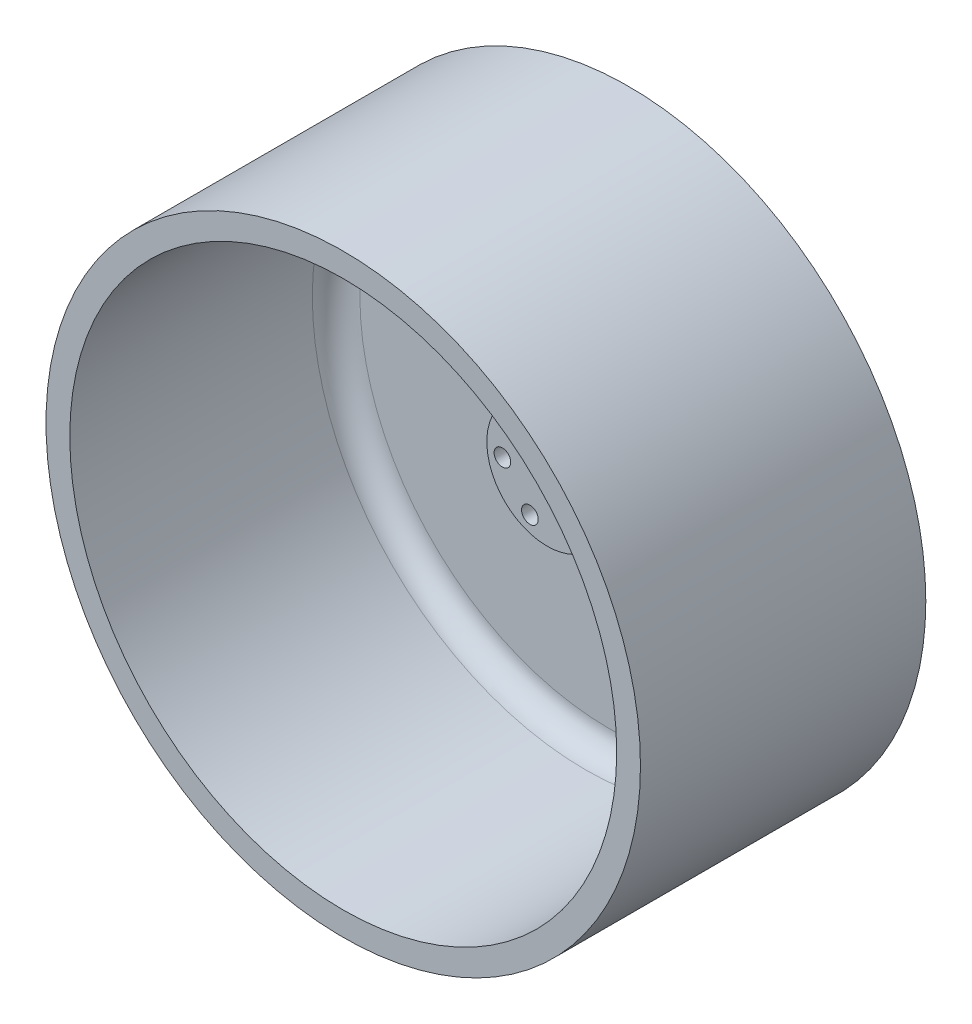
ISO-10303-21;
HEADER;
FILE_DESCRIPTION(('STEP AP214'),'2;1');
FILE_NAME('part.step','',(''),(''),'','','');
FILE_SCHEMA(('AUTOMOTIVE_DESIGN { 1 0 10303 214 1 1 1 1 }'));
ENDSEC;
DATA;
#1=APPLICATION_CONTEXT('core data for automotive mechanical design processes');
#2=APPLICATION_PROTOCOL_DEFINITION('international standard','automotive_design',2000,#1);
#3=PRODUCT_CONTEXT('',#1,'mechanical');
#4=PRODUCT('Part','Part','',(#3));
#5=PRODUCT_RELATED_PRODUCT_CATEGORY('part','',(#4));
#6=PRODUCT_DEFINITION_FORMATION('','',#4);
#7=PRODUCT_DEFINITION_CONTEXT('part definition',#1,'design');
#8=PRODUCT_DEFINITION('design','',#6,#7);
#9=PRODUCT_DEFINITION_SHAPE('','',#8);
#10=(LENGTH_UNIT() NAMED_UNIT(*) SI_UNIT(.MILLI.,.METRE.));
#11=(NAMED_UNIT(*) PLANE_ANGLE_UNIT() SI_UNIT($,.RADIAN.));
#12=(NAMED_UNIT(*) SI_UNIT($,.STERADIAN.) SOLID_ANGLE_UNIT());
#13=UNCERTAINTY_MEASURE_WITH_UNIT(LENGTH_MEASURE(1.E-05),#10,'distance_accuracy_value','');
#14=(GEOMETRIC_REPRESENTATION_CONTEXT(3) GLOBAL_UNCERTAINTY_ASSIGNED_CONTEXT((#13)) GLOBAL_UNIT_ASSIGNED_CONTEXT((#10,
#11,#12)) REPRESENTATION_CONTEXT('',''));
#15=CARTESIAN_POINT('',(0.,0.,0.));
#16=DIRECTION('',(0.,0.,1.));
#17=DIRECTION('',(1.,0.,0.));
#18=AXIS2_PLACEMENT_3D('',#15,#16,#17);
#19=CARTESIAN_POINT('',(-5.78430112425201,7.53603745372705,0.));
#20=DIRECTION('',(0.,0.,1.));
#21=DIRECTION('',(1.,0.,0.));
#22=AXIS2_PLACEMENT_3D('',#19,#20,#21);
#23=CYLINDRICAL_SURFACE('',#22,1.75);
#24=CARTESIAN_POINT('',(-5.78430112425201,7.53603745372705,17.11));
#25=DIRECTION('',(0.,0.,1.));
#26=DIRECTION('',(1.,0.,0.));
#27=AXIS2_PLACEMENT_3D('',#24,#25,#26);
#28=CIRCLE('',#27,1.75);
#29=CARTESIAN_POINT('',(-4.03430112425201,7.53603745372705,17.11));
#30=VERTEX_POINT('',#29);
#31=EDGE_CURVE('E88',#30,#30,#28,.T.);
#32=ORIENTED_EDGE('',*,*,#31,.T.);
#33=EDGE_LOOP('',(#32));
#34=FACE_BOUND('',#33,.T.);
#35=CARTESIAN_POINT('',(-5.78430112425201,7.53603745372705,3.));
#36=DIRECTION('',(0.,0.,-1.));
#37=DIRECTION('',(-1.,0.,0.));
#38=AXIS2_PLACEMENT_3D('',#35,#36,#37);
#39=CIRCLE('',#38,1.75);
#40=CARTESIAN_POINT('',(-7.53430112425201,7.53603745372705,3.));
#41=VERTEX_POINT('',#40);
#42=EDGE_CURVE('E57',#41,#41,#39,.F.);
#43=ORIENTED_EDGE('',*,*,#42,.F.);
#44=EDGE_LOOP('',(#43));
#45=FACE_BOUND('',#44,.T.);
#46=ADVANCED_FACE('F36',(#34,#45),#23,.F.);
#47=CARTESIAN_POINT('',(3.63424931667262,8.77737044360466,0.));
#48=DIRECTION('',(0.,0.,1.));
#49=DIRECTION('',(1.,0.,0.));
#50=AXIS2_PLACEMENT_3D('',#47,#48,#49);
#51=CYLINDRICAL_SURFACE('',#50,1.75);
#52=CARTESIAN_POINT('',(3.63424931667262,8.77737044360466,17.11));
#53=DIRECTION('',(0.,0.,1.));
#54=DIRECTION('',(1.,0.,0.));
#55=AXIS2_PLACEMENT_3D('',#52,#53,#54);
#56=CIRCLE('',#55,1.75);
#57=CARTESIAN_POINT('',(5.38424931667262,8.77737044360466,17.11));
#58=VERTEX_POINT('',#57);
#59=EDGE_CURVE('E96',#58,#58,#56,.T.);
#60=ORIENTED_EDGE('',*,*,#59,.T.);
#61=EDGE_LOOP('',(#60));
#62=FACE_BOUND('',#61,.T.);
#63=CARTESIAN_POINT('',(3.63424931667262,8.77737044360466,3.));
#64=DIRECTION('',(0.,0.,-1.));
#65=DIRECTION('',(-1.,0.,0.));
#66=AXIS2_PLACEMENT_3D('',#63,#64,#65);
#67=CIRCLE('',#66,1.75);
#68=CARTESIAN_POINT('',(1.88424931667262,8.77737044360466,3.));
#69=VERTEX_POINT('',#68);
#70=EDGE_CURVE('E61',#69,#69,#67,.F.);
#71=ORIENTED_EDGE('',*,*,#70,.F.);
#72=EDGE_LOOP('',(#71));
#73=FACE_BOUND('',#72,.T.);
#74=ADVANCED_FACE('F186',(#62,#73),#51,.F.);
#75=CARTESIAN_POINT('',(9.41855044092462,1.2413329898776,0.));
#76=DIRECTION('',(0.,0.,1.));
#77=DIRECTION('',(1.,0.,0.));
#78=AXIS2_PLACEMENT_3D('',#75,#76,#77);
#79=CYLINDRICAL_SURFACE('',#78,1.75);
#80=CARTESIAN_POINT('',(9.41855044092462,1.2413329898776,17.11));
#81=DIRECTION('',(0.,0.,1.));
#82=DIRECTION('',(1.,0.,0.));
#83=AXIS2_PLACEMENT_3D('',#80,#81,#82);
#84=CIRCLE('',#83,1.75);
#85=CARTESIAN_POINT('',(11.1685504409246,1.2413329898776,17.11));
#86=VERTEX_POINT('',#85);
#87=EDGE_CURVE('E92',#86,#86,#84,.T.);
#88=ORIENTED_EDGE('',*,*,#87,.T.);
#89=EDGE_LOOP('',(#88));
#90=FACE_BOUND('',#89,.T.);
#91=CARTESIAN_POINT('',(9.41855044092462,1.2413329898776,3.));
#92=DIRECTION('',(0.,0.,-1.));
#93=DIRECTION('',(-1.,0.,0.));
#94=AXIS2_PLACEMENT_3D('',#91,#92,#93);
#95=CIRCLE('',#94,1.75);
#96=CARTESIAN_POINT('',(7.66855044092462,1.2413329898776,3.));
#97=VERTEX_POINT('',#96);
#98=EDGE_CURVE('E64',#97,#97,#95,.F.);
#99=ORIENTED_EDGE('',*,*,#98,.F.);
#100=EDGE_LOOP('',(#99));
#101=FACE_BOUND('',#100,.T.);
#102=ADVANCED_FACE('F192',(#90,#101),#79,.F.);
#103=CARTESIAN_POINT('',(5.784301124252,-7.53603745372706,0.));
#104=DIRECTION('',(0.,0.,1.));
#105=DIRECTION('',(1.,0.,0.));
#106=AXIS2_PLACEMENT_3D('',#103,#104,#105);
#107=CYLINDRICAL_SURFACE('',#106,1.75);
#108=CARTESIAN_POINT('',(5.784301124252,-7.53603745372706,17.11));
#109=DIRECTION('',(0.,0.,1.));
#110=DIRECTION('',(1.,0.,0.));
#111=AXIS2_PLACEMENT_3D('',#108,#109,#110);
#112=CIRCLE('',#111,1.75);
#113=CARTESIAN_POINT('',(7.534301124252,-7.53603745372706,17.11));
#114=VERTEX_POINT('',#113);
#115=EDGE_CURVE('E95',#114,#114,#112,.T.);
#116=ORIENTED_EDGE('',*,*,#115,.T.);
#117=EDGE_LOOP('',(#116));
#118=FACE_BOUND('',#117,.T.);
#119=CARTESIAN_POINT('',(5.784301124252,-7.53603745372706,3.));
#120=DIRECTION('',(0.,0.,-1.));
#121=DIRECTION('',(-1.,0.,0.));
#122=AXIS2_PLACEMENT_3D('',#119,#120,#121);
#123=CIRCLE('',#122,1.75);
#124=CARTESIAN_POINT('',(4.034301124252,-7.53603745372706,3.));
#125=VERTEX_POINT('',#124);
#126=EDGE_CURVE('E67',#125,#125,#123,.F.);
#127=ORIENTED_EDGE('',*,*,#126,.F.);
#128=EDGE_LOOP('',(#127));
#129=FACE_BOUND('',#128,.T.);
#130=ADVANCED_FACE('F271',(#118,#129),#107,.F.);
#131=CARTESIAN_POINT('',(-3.63424931667262,-8.77737044360466,0.));
#132=DIRECTION('',(0.,0.,1.));
#133=DIRECTION('',(1.,0.,0.));
#134=AXIS2_PLACEMENT_3D('',#131,#132,#133);
#135=CYLINDRICAL_SURFACE('',#134,1.75);
#136=CARTESIAN_POINT('',(-3.63424931667262,-8.77737044360466,17.11));
#137=DIRECTION('',(0.,0.,1.));
#138=DIRECTION('',(1.,0.,0.));
#139=AXIS2_PLACEMENT_3D('',#136,#137,#138);
#140=CIRCLE('',#139,1.75);
#141=CARTESIAN_POINT('',(-1.88424931667262,-8.77737044360466,17.11));
#142=VERTEX_POINT('',#141);
#143=EDGE_CURVE('E99',#142,#142,#140,.T.);
#144=ORIENTED_EDGE('',*,*,#143,.T.);
#145=EDGE_LOOP('',(#144));
#146=FACE_BOUND('',#145,.T.);
#147=CARTESIAN_POINT('',(-3.63424931667262,-8.77737044360466,3.));
#148=DIRECTION('',(0.,0.,-1.));
#149=DIRECTION('',(-1.,0.,0.));
#150=AXIS2_PLACEMENT_3D('',#147,#148,#149);
#151=CIRCLE('',#150,1.75);
#152=CARTESIAN_POINT('',(-5.38424931667262,-8.77737044360466,3.));
#153=VERTEX_POINT('',#152);
#154=EDGE_CURVE('E70',#153,#153,#151,.F.);
#155=ORIENTED_EDGE('',*,*,#154,.F.);
#156=EDGE_LOOP('',(#155));
#157=FACE_BOUND('',#156,.T.);
#158=ADVANCED_FACE('F181',(#146,#157),#135,.F.);
#159=CARTESIAN_POINT('',(-9.41855044092462,-1.2413329898776,0.));
#160=DIRECTION('',(0.,0.,1.));
#161=DIRECTION('',(1.,0.,0.));
#162=AXIS2_PLACEMENT_3D('',#159,#160,#161);
#163=CYLINDRICAL_SURFACE('',#162,1.75);
#164=CARTESIAN_POINT('',(-9.41855044092462,-1.2413329898776,17.11));
#165=DIRECTION('',(0.,0.,1.));
#166=DIRECTION('',(1.,0.,0.));
#167=AXIS2_PLACEMENT_3D('',#164,#165,#166);
#168=CIRCLE('',#167,1.75);
#169=CARTESIAN_POINT('',(-7.66855044092462,-1.2413329898776,17.11));
#170=VERTEX_POINT('',#169);
#171=EDGE_CURVE('E91',#170,#170,#168,.T.);
#172=ORIENTED_EDGE('',*,*,#171,.T.);
#173=EDGE_LOOP('',(#172));
#174=FACE_BOUND('',#173,.T.);
#175=CARTESIAN_POINT('',(-9.41855044092462,-1.2413329898776,3.));
#176=DIRECTION('',(0.,0.,-1.));
#177=DIRECTION('',(-1.,0.,0.));
#178=AXIS2_PLACEMENT_3D('',#175,#176,#177);
#179=CIRCLE('',#178,1.75);
#180=CARTESIAN_POINT('',(-11.1685504409246,-1.2413329898776,3.));
#181=VERTEX_POINT('',#180);
#182=EDGE_CURVE('E73',#181,#181,#179,.F.);
#183=ORIENTED_EDGE('',*,*,#182,.F.);
#184=EDGE_LOOP('',(#183));
#185=FACE_BOUND('',#184,.T.);
#186=ADVANCED_FACE('F172',(#174,#185),#163,.F.);
#187=CARTESIAN_POINT('',(0.,0.,60.));
#188=DIRECTION('',(0.,0.,-1.));
#189=DIRECTION('',(-1.,0.,0.));
#190=AXIS2_PLACEMENT_3D('',#187,#188,#189);
#191=CYLINDRICAL_SURFACE('',#190,62.5);
#192=CARTESIAN_POINT('',(0.,0.,60.));
#193=DIRECTION('',(0.,0.,1.));
#194=DIRECTION('',(1.,0.,0.));
#195=AXIS2_PLACEMENT_3D('',#192,#193,#194);
#196=CIRCLE('',#195,62.5);
#197=CARTESIAN_POINT('',(62.5,0.,60.));
#198=VERTEX_POINT('',#197);
#199=EDGE_CURVE('E56',#198,#198,#196,.T.);
#200=ORIENTED_EDGE('',*,*,#199,.F.);
#201=EDGE_LOOP('',(#200));
#202=FACE_BOUND('',#201,.T.);
#203=CARTESIAN_POINT('',(0.,0.,0.));
#204=DIRECTION('',(0.,0.,1.));
#205=DIRECTION('',(1.,0.,0.));
#206=AXIS2_PLACEMENT_3D('',#203,#204,#205);
#207=CIRCLE('',#206,62.5);
#208=CARTESIAN_POINT('',(62.5,0.,0.));
#209=VERTEX_POINT('',#208);
#210=EDGE_CURVE('E77',#209,#209,#207,.T.);
#211=ORIENTED_EDGE('',*,*,#210,.T.);
#212=EDGE_LOOP('',(#211));
#213=FACE_BOUND('',#212,.T.);
#214=ADVANCED_FACE('F170',(#202,#213),#191,.T.);
#215=CARTESIAN_POINT('',(0.,0.,60.));
#216=DIRECTION('',(0.,0.,1.));
#217=DIRECTION('',(1.,0.,0.));
#218=AXIS2_PLACEMENT_3D('',#215,#216,#217);
#219=PLANE('',#218);
#220=CARTESIAN_POINT('',(0.,0.,60.));
#221=DIRECTION('',(0.,0.,1.));
#222=DIRECTION('',(1.,0.,0.));
#223=AXIS2_PLACEMENT_3D('',#220,#221,#222);
#224=CIRCLE('',#223,57.5);
#225=CARTESIAN_POINT('',(57.5,0.,60.));
#226=VERTEX_POINT('',#225);
#227=EDGE_CURVE('E80',#226,#226,#224,.T.);
#228=ORIENTED_EDGE('',*,*,#227,.F.);
#229=EDGE_LOOP('',(#228));
#230=FACE_BOUND('',#229,.T.);
#231=ORIENTED_EDGE('',*,*,#199,.T.);
#232=EDGE_LOOP('',(#231));
#233=FACE_BOUND('',#232,.T.);
#234=ADVANCED_FACE('F161',(#230,#233),#219,.T.);
#235=CARTESIAN_POINT('',(0.,0.,0.));
#236=DIRECTION('',(0.,0.,1.));
#237=DIRECTION('',(1.,0.,0.));
#238=AXIS2_PLACEMENT_3D('',#235,#236,#237);
#239=PLANE('',#238);
#240=CARTESIAN_POINT('',(3.63424931667262,8.77737044360466,0.));
#241=DIRECTION('',(0.,0.,-1.));
#242=DIRECTION('',(-1.,0.,0.));
#243=AXIS2_PLACEMENT_3D('',#240,#241,#242);
#244=CIRCLE('',#243,3.25);
#245=CARTESIAN_POINT('',(0.384249316672616,8.77737044360466,0.));
#246=VERTEX_POINT('',#245);
#247=EDGE_CURVE('E136',#246,#246,#244,.T.);
#248=ORIENTED_EDGE('',*,*,#247,.F.);
#249=EDGE_LOOP('',(#248));
#250=FACE_BOUND('',#249,.T.);
#251=CARTESIAN_POINT('',(-5.78430112425201,7.53603745372705,0.));
#252=DIRECTION('',(0.,0.,-1.));
#253=DIRECTION('',(-1.,0.,0.));
#254=AXIS2_PLACEMENT_3D('',#251,#252,#253);
#255=CIRCLE('',#254,3.25);
#256=CARTESIAN_POINT('',(-9.03430112425201,7.53603745372705,0.));
#257=VERTEX_POINT('',#256);
#258=EDGE_CURVE('E130',#257,#257,#255,.T.);
#259=ORIENTED_EDGE('',*,*,#258,.F.);
#260=EDGE_LOOP('',(#259));
#261=FACE_BOUND('',#260,.T.);
#262=CARTESIAN_POINT('',(-9.41855044092462,-1.2413329898776,0.));
#263=DIRECTION('',(0.,0.,-1.));
#264=DIRECTION('',(-1.,0.,0.));
#265=AXIS2_PLACEMENT_3D('',#262,#263,#264);
#266=CIRCLE('',#265,3.25);
#267=CARTESIAN_POINT('',(-12.6685504409246,-1.2413329898776,0.));
#268=VERTEX_POINT('',#267);
#269=EDGE_CURVE('E124',#268,#268,#266,.T.);
#270=ORIENTED_EDGE('',*,*,#269,.F.);
#271=EDGE_LOOP('',(#270));
#272=FACE_BOUND('',#271,.T.);
#273=CARTESIAN_POINT('',(-3.63424931667262,-8.77737044360466,0.));
#274=DIRECTION('',(0.,0.,-1.));
#275=DIRECTION('',(-1.,0.,0.));
#276=AXIS2_PLACEMENT_3D('',#273,#274,#275);
#277=CIRCLE('',#276,3.25);
#278=CARTESIAN_POINT('',(-6.88424931667262,-8.77737044360466,0.));
#279=VERTEX_POINT('',#278);
#280=EDGE_CURVE('E117',#279,#279,#277,.T.);
#281=ORIENTED_EDGE('',*,*,#280,.F.);
#282=EDGE_LOOP('',(#281));
#283=FACE_BOUND('',#282,.T.);
#284=CARTESIAN_POINT('',(5.784301124252,-7.53603745372706,0.));
#285=DIRECTION('',(0.,0.,-1.));
#286=DIRECTION('',(-1.,0.,0.));
#287=AXIS2_PLACEMENT_3D('',#284,#285,#286);
#288=CIRCLE('',#287,3.25);
#289=CARTESIAN_POINT('',(2.534301124252,-7.53603745372706,0.));
#290=VERTEX_POINT('',#289);
#291=EDGE_CURVE('E141',#290,#290,#288,.T.);
#292=ORIENTED_EDGE('',*,*,#291,.F.);
#293=EDGE_LOOP('',(#292));
#294=FACE_BOUND('',#293,.T.);
#295=CARTESIAN_POINT('',(9.41855044092462,1.2413329898776,0.));
#296=DIRECTION('',(0.,0.,-1.));
#297=DIRECTION('',(-1.,0.,0.));
#298=AXIS2_PLACEMENT_3D('',#295,#296,#297);
#299=CIRCLE('',#298,3.25);
#300=CARTESIAN_POINT('',(6.16855044092462,1.2413329898776,0.));
#301=VERTEX_POINT('',#300);
#302=EDGE_CURVE('E111',#301,#301,#299,.T.);
#303=ORIENTED_EDGE('',*,*,#302,.F.);
#304=EDGE_LOOP('',(#303));
#305=FACE_BOUND('',#304,.T.);
#306=CARTESIAN_POINT('',(0.,0.,0.));
#307=DIRECTION('',(0.,0.,1.));
#308=DIRECTION('',(1.,0.,0.));
#309=AXIS2_PLACEMENT_3D('',#306,#307,#308);
#310=CIRCLE('',#309,3.);
#311=CARTESIAN_POINT('',(3.,0.,0.));
#312=VERTEX_POINT('',#311);
#313=EDGE_CURVE('E106',#312,#312,#310,.T.);
#314=ORIENTED_EDGE('',*,*,#313,.T.);
#315=EDGE_LOOP('',(#314));
#316=FACE_BOUND('',#315,.T.);
#317=ORIENTED_EDGE('',*,*,#210,.F.);
#318=EDGE_LOOP('',(#317));
#319=FACE_BOUND('',#318,.T.);
#320=ADVANCED_FACE('F157',(#250,#261,#272,#283,#294,#305,#316,#319),#239,.F.);
#321=CARTESIAN_POINT('',(0.,0.,-162.634559672906));
#322=DIRECTION('',(0.,0.,1.));
#323=DIRECTION('',(1.,0.,0.));
#324=AXIS2_PLACEMENT_3D('',#321,#322,#323);
#325=CYLINDRICAL_SURFACE('',#324,57.5);
#326=CARTESIAN_POINT('',(0.,0.,9.00000000000001));
#327=DIRECTION('',(0.,0.,1.));
#328=DIRECTION('',(1.,0.,0.));
#329=AXIS2_PLACEMENT_3D('',#326,#327,#328);
#330=CIRCLE('',#329,57.5);
#331=CARTESIAN_POINT('',(57.5,0.,9.00000000000001));
#332=VERTEX_POINT('',#331);
#333=EDGE_CURVE('E51',#332,#332,#330,.F.);
#334=ORIENTED_EDGE('',*,*,#333,.T.);
#335=EDGE_LOOP('',(#334));
#336=FACE_BOUND('',#335,.T.);
#337=ORIENTED_EDGE('',*,*,#227,.T.);
#338=EDGE_LOOP('',(#337));
#339=FACE_BOUND('',#338,.T.);
#340=ADVANCED_FACE('F160',(#336,#339),#325,.F.);
#341=CARTESIAN_POINT('',(0.,0.,4.));
#342=DIRECTION('',(0.,0.,1.));
#343=DIRECTION('',(1.,0.,0.));
#344=AXIS2_PLACEMENT_3D('',#341,#342,#343);
#345=PLANE('',#344);
#346=CARTESIAN_POINT('',(0.,0.,4.));
#347=DIRECTION('',(0.,0.,1.));
#348=DIRECTION('',(1.,0.,0.));
#349=AXIS2_PLACEMENT_3D('',#346,#347,#348);
#350=CIRCLE('',#349,22.7);
#351=CARTESIAN_POINT('',(22.7,0.,4.));
#352=VERTEX_POINT('',#351);
#353=EDGE_CURVE('E12',#352,#352,#350,.F.);
#354=ORIENTED_EDGE('',*,*,#353,.T.);
#355=EDGE_LOOP('',(#354));
#356=FACE_BOUND('',#355,.T.);
#357=CARTESIAN_POINT('',(0.,0.,4.));
#358=DIRECTION('',(0.,0.,1.));
#359=DIRECTION('',(1.,0.,0.));
#360=AXIS2_PLACEMENT_3D('',#357,#358,#359);
#361=CIRCLE('',#360,52.5);
#362=CARTESIAN_POINT('',(52.5,0.,4.));
#363=VERTEX_POINT('',#362);
#364=EDGE_CURVE('E47',#363,#363,#361,.T.);
#365=ORIENTED_EDGE('',*,*,#364,.T.);
#366=EDGE_LOOP('',(#365));
#367=FACE_BOUND('',#366,.T.);
#368=ADVANCED_FACE('F203',(#356,#367),#345,.T.);
#369=CARTESIAN_POINT('',(0.,0.,65.9210244842766));
#370=DIRECTION('',(0.,0.,-1.));
#371=DIRECTION('',(-1.,0.,0.));
#372=AXIS2_PLACEMENT_3D('',#369,#370,#371);
#373=CYLINDRICAL_SURFACE('',#372,12.7);
#374=CARTESIAN_POINT('',(0.,0.,14.));
#375=DIRECTION('',(0.,0.,1.));
#376=DIRECTION('',(1.,0.,0.));
#377=AXIS2_PLACEMENT_3D('',#374,#375,#376);
#378=CIRCLE('',#377,12.7);
#379=CARTESIAN_POINT('',(12.7,0.,14.));
#380=VERTEX_POINT('',#379);
#381=EDGE_CURVE('E43',#380,#380,#378,.T.);
#382=ORIENTED_EDGE('',*,*,#381,.T.);
#383=EDGE_LOOP('',(#382));
#384=FACE_BOUND('',#383,.T.);
#385=CARTESIAN_POINT('',(0.,0.,17.11));
#386=DIRECTION('',(0.,0.,1.));
#387=DIRECTION('',(1.,0.,0.));
#388=AXIS2_PLACEMENT_3D('',#385,#386,#387);
#389=CIRCLE('',#388,12.7);
#390=CARTESIAN_POINT('',(12.7,0.,17.11));
#391=VERTEX_POINT('',#390);
#392=EDGE_CURVE('E85',#391,#391,#389,.T.);
#393=ORIENTED_EDGE('',*,*,#392,.F.);
#394=EDGE_LOOP('',(#393));
#395=FACE_BOUND('',#394,.T.);
#396=ADVANCED_FACE('F199',(#384,#395),#373,.T.);
#397=CARTESIAN_POINT('',(0.,0.,17.11));
#398=DIRECTION('',(0.,0.,1.));
#399=DIRECTION('',(1.,0.,0.));
#400=AXIS2_PLACEMENT_3D('',#397,#398,#399);
#401=PLANE('',#400);
#402=ORIENTED_EDGE('',*,*,#171,.F.);
#403=EDGE_LOOP('',(#402));
#404=FACE_BOUND('',#403,.T.);
#405=ORIENTED_EDGE('',*,*,#143,.F.);
#406=EDGE_LOOP('',(#405));
#407=FACE_BOUND('',#406,.T.);
#408=ORIENTED_EDGE('',*,*,#115,.F.);
#409=EDGE_LOOP('',(#408));
#410=FACE_BOUND('',#409,.T.);
#411=ORIENTED_EDGE('',*,*,#87,.F.);
#412=EDGE_LOOP('',(#411));
#413=FACE_BOUND('',#412,.T.);
#414=ORIENTED_EDGE('',*,*,#59,.F.);
#415=EDGE_LOOP('',(#414));
#416=FACE_BOUND('',#415,.T.);
#417=CARTESIAN_POINT('',(0.,0.,17.11));
#418=DIRECTION('',(0.,0.,1.));
#419=DIRECTION('',(1.,0.,0.));
#420=AXIS2_PLACEMENT_3D('',#417,#418,#419);
#421=CIRCLE('',#420,3.);
#422=CARTESIAN_POINT('',(3.,0.,17.11));
#423=VERTEX_POINT('',#422);
#424=EDGE_CURVE('E60',#423,#423,#421,.T.);
#425=ORIENTED_EDGE('',*,*,#424,.F.);
#426=EDGE_LOOP('',(#425));
#427=FACE_BOUND('',#426,.T.);
#428=ORIENTED_EDGE('',*,*,#31,.F.);
#429=EDGE_LOOP('',(#428));
#430=FACE_BOUND('',#429,.T.);
#431=ORIENTED_EDGE('',*,*,#392,.T.);
#432=EDGE_LOOP('',(#431));
#433=FACE_BOUND('',#432,.T.);
#434=ADVANCED_FACE('F202',(#404,#407,#410,#413,#416,#427,#430,#433),#401,.T.);
#435=CARTESIAN_POINT('',(0.,0.,0.));
#436=DIRECTION('',(0.,0.,1.));
#437=DIRECTION('',(1.,0.,0.));
#438=AXIS2_PLACEMENT_3D('',#435,#436,#437);
#439=CYLINDRICAL_SURFACE('',#438,3.);
#440=ORIENTED_EDGE('',*,*,#313,.F.);
#441=EDGE_LOOP('',(#440));
#442=FACE_BOUND('',#441,.T.);
#443=ORIENTED_EDGE('',*,*,#424,.T.);
#444=EDGE_LOOP('',(#443));
#445=FACE_BOUND('',#444,.T.);
#446=ADVANCED_FACE('F206',(#442,#445),#439,.F.);
#447=CARTESIAN_POINT('',(-9.41855044092462,-1.2413329898776,3.));
#448=DIRECTION('',(0.,0.,-1.));
#449=DIRECTION('',(-1.,0.,0.));
#450=AXIS2_PLACEMENT_3D('',#447,#448,#449);
#451=PLANE('',#450);
#452=CARTESIAN_POINT('',(-9.41855044092462,-1.2413329898776,3.));
#453=DIRECTION('',(0.,0.,-1.));
#454=DIRECTION('',(-1.,0.,0.));
#455=AXIS2_PLACEMENT_3D('',#452,#453,#454);
#456=CIRCLE('',#455,3.25);
#457=CARTESIAN_POINT('',(-12.6685504409246,-1.2413329898776,3.));
#458=VERTEX_POINT('',#457);
#459=EDGE_CURVE('E127',#458,#458,#456,.T.);
#460=ORIENTED_EDGE('',*,*,#459,.T.);
#461=EDGE_LOOP('',(#460));
#462=FACE_BOUND('',#461,.T.);
#463=ORIENTED_EDGE('',*,*,#182,.T.);
#464=EDGE_LOOP('',(#463));
#465=FACE_BOUND('',#464,.T.);
#466=ADVANCED_FACE('F243',(#462,#465),#451,.T.);
#467=CARTESIAN_POINT('',(-9.41855044092462,-1.2413329898776,3.));
#468=DIRECTION('',(0.,0.,-1.));
#469=DIRECTION('',(-1.,0.,0.));
#470=AXIS2_PLACEMENT_3D('',#467,#468,#469);
#471=CYLINDRICAL_SURFACE('',#470,3.25);
#472=ORIENTED_EDGE('',*,*,#459,.F.);
#473=EDGE_LOOP('',(#472));
#474=FACE_BOUND('',#473,.T.);
#475=ORIENTED_EDGE('',*,*,#269,.T.);
#476=EDGE_LOOP('',(#475));
#477=FACE_BOUND('',#476,.T.);
#478=ADVANCED_FACE('F246',(#474,#477),#471,.F.);
#479=CARTESIAN_POINT('',(-3.63424931667262,-8.77737044360466,3.));
#480=DIRECTION('',(0.,0.,-1.));
#481=DIRECTION('',(-1.,0.,0.));
#482=AXIS2_PLACEMENT_3D('',#479,#480,#481);
#483=PLANE('',#482);
#484=CARTESIAN_POINT('',(-3.63424931667262,-8.77737044360466,3.));
#485=DIRECTION('',(0.,0.,-1.));
#486=DIRECTION('',(-1.,0.,0.));
#487=AXIS2_PLACEMENT_3D('',#484,#485,#486);
#488=CIRCLE('',#487,3.25);
#489=CARTESIAN_POINT('',(-6.88424931667262,-8.77737044360466,3.));
#490=VERTEX_POINT('',#489);
#491=EDGE_CURVE('E120',#490,#490,#488,.T.);
#492=ORIENTED_EDGE('',*,*,#491,.T.);
#493=EDGE_LOOP('',(#492));
#494=FACE_BOUND('',#493,.T.);
#495=ORIENTED_EDGE('',*,*,#154,.T.);
#496=EDGE_LOOP('',(#495));
#497=FACE_BOUND('',#496,.T.);
#498=ADVANCED_FACE('F250',(#494,#497),#483,.T.);
#499=CARTESIAN_POINT('',(-3.63424931667262,-8.77737044360466,3.));
#500=DIRECTION('',(0.,0.,-1.));
#501=DIRECTION('',(-1.,0.,0.));
#502=AXIS2_PLACEMENT_3D('',#499,#500,#501);
#503=CYLINDRICAL_SURFACE('',#502,3.25);
#504=ORIENTED_EDGE('',*,*,#491,.F.);
#505=EDGE_LOOP('',(#504));
#506=FACE_BOUND('',#505,.T.);
#507=ORIENTED_EDGE('',*,*,#280,.T.);
#508=EDGE_LOOP('',(#507));
#509=FACE_BOUND('',#508,.T.);
#510=ADVANCED_FACE('F254',(#506,#509),#503,.F.);
#511=CARTESIAN_POINT('',(5.784301124252,-7.53603745372706,3.));
#512=DIRECTION('',(0.,0.,-1.));
#513=DIRECTION('',(-1.,0.,0.));
#514=AXIS2_PLACEMENT_3D('',#511,#512,#513);
#515=PLANE('',#514);
#516=CARTESIAN_POINT('',(5.784301124252,-7.53603745372706,3.));
#517=DIRECTION('',(0.,0.,-1.));
#518=DIRECTION('',(-1.,0.,0.));
#519=AXIS2_PLACEMENT_3D('',#516,#517,#518);
#520=CIRCLE('',#519,3.25);
#521=CARTESIAN_POINT('',(2.534301124252,-7.53603745372706,3.));
#522=VERTEX_POINT('',#521);
#523=EDGE_CURVE('E121',#522,#522,#520,.T.);
#524=ORIENTED_EDGE('',*,*,#523,.T.);
#525=EDGE_LOOP('',(#524));
#526=FACE_BOUND('',#525,.T.);
#527=ORIENTED_EDGE('',*,*,#126,.T.);
#528=EDGE_LOOP('',(#527));
#529=FACE_BOUND('',#528,.T.);
#530=ADVANCED_FACE('F147',(#526,#529),#515,.T.);
#531=CARTESIAN_POINT('',(5.784301124252,-7.53603745372706,3.));
#532=DIRECTION('',(0.,0.,-1.));
#533=DIRECTION('',(-1.,0.,0.));
#534=AXIS2_PLACEMENT_3D('',#531,#532,#533);
#535=CYLINDRICAL_SURFACE('',#534,3.25);
#536=ORIENTED_EDGE('',*,*,#523,.F.);
#537=EDGE_LOOP('',(#536));
#538=FACE_BOUND('',#537,.T.);
#539=ORIENTED_EDGE('',*,*,#291,.T.);
#540=EDGE_LOOP('',(#539));
#541=FACE_BOUND('',#540,.T.);
#542=ADVANCED_FACE('F150',(#538,#541),#535,.F.);
#543=CARTESIAN_POINT('',(9.41855044092462,1.2413329898776,3.));
#544=DIRECTION('',(0.,0.,-1.));
#545=DIRECTION('',(-1.,0.,0.));
#546=AXIS2_PLACEMENT_3D('',#543,#544,#545);
#547=PLANE('',#546);
#548=CARTESIAN_POINT('',(9.41855044092462,1.2413329898776,3.));
#549=DIRECTION('',(0.,0.,-1.));
#550=DIRECTION('',(-1.,0.,0.));
#551=AXIS2_PLACEMENT_3D('',#548,#549,#550);
#552=CIRCLE('',#551,3.25);
#553=CARTESIAN_POINT('',(6.16855044092462,1.2413329898776,3.));
#554=VERTEX_POINT('',#553);
#555=EDGE_CURVE('E76',#554,#554,#552,.T.);
#556=ORIENTED_EDGE('',*,*,#555,.T.);
#557=EDGE_LOOP('',(#556));
#558=FACE_BOUND('',#557,.T.);
#559=ORIENTED_EDGE('',*,*,#98,.T.);
#560=EDGE_LOOP('',(#559));
#561=FACE_BOUND('',#560,.T.);
#562=ADVANCED_FACE('F153',(#558,#561),#547,.T.);
#563=CARTESIAN_POINT('',(9.41855044092462,1.2413329898776,3.));
#564=DIRECTION('',(0.,0.,-1.));
#565=DIRECTION('',(-1.,0.,0.));
#566=AXIS2_PLACEMENT_3D('',#563,#564,#565);
#567=CYLINDRICAL_SURFACE('',#566,3.25);
#568=ORIENTED_EDGE('',*,*,#555,.F.);
#569=EDGE_LOOP('',(#568));
#570=FACE_BOUND('',#569,.T.);
#571=ORIENTED_EDGE('',*,*,#302,.T.);
#572=EDGE_LOOP('',(#571));
#573=FACE_BOUND('',#572,.T.);
#574=ADVANCED_FACE('F261',(#570,#573),#567,.F.);
#575=CARTESIAN_POINT('',(3.63424931667262,8.77737044360466,3.));
#576=DIRECTION('',(0.,0.,-1.));
#577=DIRECTION('',(-1.,0.,0.));
#578=AXIS2_PLACEMENT_3D('',#575,#576,#577);
#579=PLANE('',#578);
#580=CARTESIAN_POINT('',(3.63424931667262,8.77737044360466,3.));
#581=DIRECTION('',(0.,0.,-1.));
#582=DIRECTION('',(-1.,0.,0.));
#583=AXIS2_PLACEMENT_3D('',#580,#581,#582);
#584=CIRCLE('',#583,3.25);
#585=CARTESIAN_POINT('',(0.384249316672616,8.77737044360466,3.));
#586=VERTEX_POINT('',#585);
#587=EDGE_CURVE('E114',#586,#586,#584,.T.);
#588=ORIENTED_EDGE('',*,*,#587,.T.);
#589=EDGE_LOOP('',(#588));
#590=FACE_BOUND('',#589,.T.);
#591=ORIENTED_EDGE('',*,*,#70,.T.);
#592=EDGE_LOOP('',(#591));
#593=FACE_BOUND('',#592,.T.);
#594=ADVANCED_FACE('F264',(#590,#593),#579,.T.);
#595=CARTESIAN_POINT('',(3.63424931667262,8.77737044360466,3.));
#596=DIRECTION('',(0.,0.,-1.));
#597=DIRECTION('',(-1.,0.,0.));
#598=AXIS2_PLACEMENT_3D('',#595,#596,#597);
#599=CYLINDRICAL_SURFACE('',#598,3.25);
#600=ORIENTED_EDGE('',*,*,#587,.F.);
#601=EDGE_LOOP('',(#600));
#602=FACE_BOUND('',#601,.T.);
#603=ORIENTED_EDGE('',*,*,#247,.T.);
#604=EDGE_LOOP('',(#603));
#605=FACE_BOUND('',#604,.T.);
#606=ADVANCED_FACE('F236',(#602,#605),#599,.F.);
#607=CARTESIAN_POINT('',(-5.78430112425201,7.53603745372705,3.));
#608=DIRECTION('',(0.,0.,-1.));
#609=DIRECTION('',(-1.,0.,0.));
#610=AXIS2_PLACEMENT_3D('',#607,#608,#609);
#611=PLANE('',#610);
#612=CARTESIAN_POINT('',(-5.78430112425201,7.53603745372705,3.));
#613=DIRECTION('',(0.,0.,-1.));
#614=DIRECTION('',(-1.,0.,0.));
#615=AXIS2_PLACEMENT_3D('',#612,#613,#614);
#616=CIRCLE('',#615,3.25);
#617=CARTESIAN_POINT('',(-9.03430112425201,7.53603745372705,3.));
#618=VERTEX_POINT('',#617);
#619=EDGE_CURVE('E133',#618,#618,#616,.T.);
#620=ORIENTED_EDGE('',*,*,#619,.T.);
#621=EDGE_LOOP('',(#620));
#622=FACE_BOUND('',#621,.T.);
#623=ORIENTED_EDGE('',*,*,#42,.T.);
#624=EDGE_LOOP('',(#623));
#625=FACE_BOUND('',#624,.T.);
#626=ADVANCED_FACE('F228',(#622,#625),#611,.T.);
#627=CARTESIAN_POINT('',(-5.78430112425201,7.53603745372705,3.));
#628=DIRECTION('',(0.,0.,-1.));
#629=DIRECTION('',(-1.,0.,0.));
#630=AXIS2_PLACEMENT_3D('',#627,#628,#629);
#631=CYLINDRICAL_SURFACE('',#630,3.25);
#632=ORIENTED_EDGE('',*,*,#619,.F.);
#633=EDGE_LOOP('',(#632));
#634=FACE_BOUND('',#633,.T.);
#635=ORIENTED_EDGE('',*,*,#258,.T.);
#636=EDGE_LOOP('',(#635));
#637=FACE_BOUND('',#636,.T.);
#638=ADVANCED_FACE('F221',(#634,#637),#631,.F.);
#639=CARTESIAN_POINT('',(0.,0.,9.00000000000001));
#640=DIRECTION('',(0.,0.,1.));
#641=DIRECTION('',(1.,0.,0.));
#642=AXIS2_PLACEMENT_3D('',#639,#640,#641);
#643=TOROIDAL_SURFACE('',#642,52.5,5.);
#644=ORIENTED_EDGE('',*,*,#364,.F.);
#645=EDGE_LOOP('',(#644));
#646=FACE_BOUND('',#645,.T.);
#647=ORIENTED_EDGE('',*,*,#333,.F.);
#648=EDGE_LOOP('',(#647));
#649=FACE_BOUND('',#648,.T.);
#650=ADVANCED_FACE('F219',(#646,#649),#643,.F.);
#651=CARTESIAN_POINT('',(0.,0.,14.));
#652=DIRECTION('',(0.,0.,1.));
#653=DIRECTION('',(1.,0.,0.));
#654=AXIS2_PLACEMENT_3D('',#651,#652,#653);
#655=TOROIDAL_SURFACE('',#654,22.7,10.);
#656=ORIENTED_EDGE('',*,*,#353,.F.);
#657=EDGE_LOOP('',(#656));
#658=FACE_BOUND('',#657,.T.);
#659=ORIENTED_EDGE('',*,*,#381,.F.);
#660=EDGE_LOOP('',(#659));
#661=FACE_BOUND('',#660,.T.);
#662=ADVANCED_FACE('F38',(#658,#661),#655,.F.);
#663=CLOSED_SHELL('',(#46,#74,#102,#130,#158,#186,#214,#234,#320,#340,#368,#396,#434,#446,#466,
#478,#498,#510,#530,#542,#562,#574,#594,#606,#626,#638,#650,#662));
#664=MANIFOLD_SOLID_BREP('B2',#663);
#665=ADVANCED_BREP_SHAPE_REPRESENTATION('',(#18,#664),#14);
#666=SHAPE_DEFINITION_REPRESENTATION(#9,#665);
ENDSEC;
END-ISO-10303-21;
